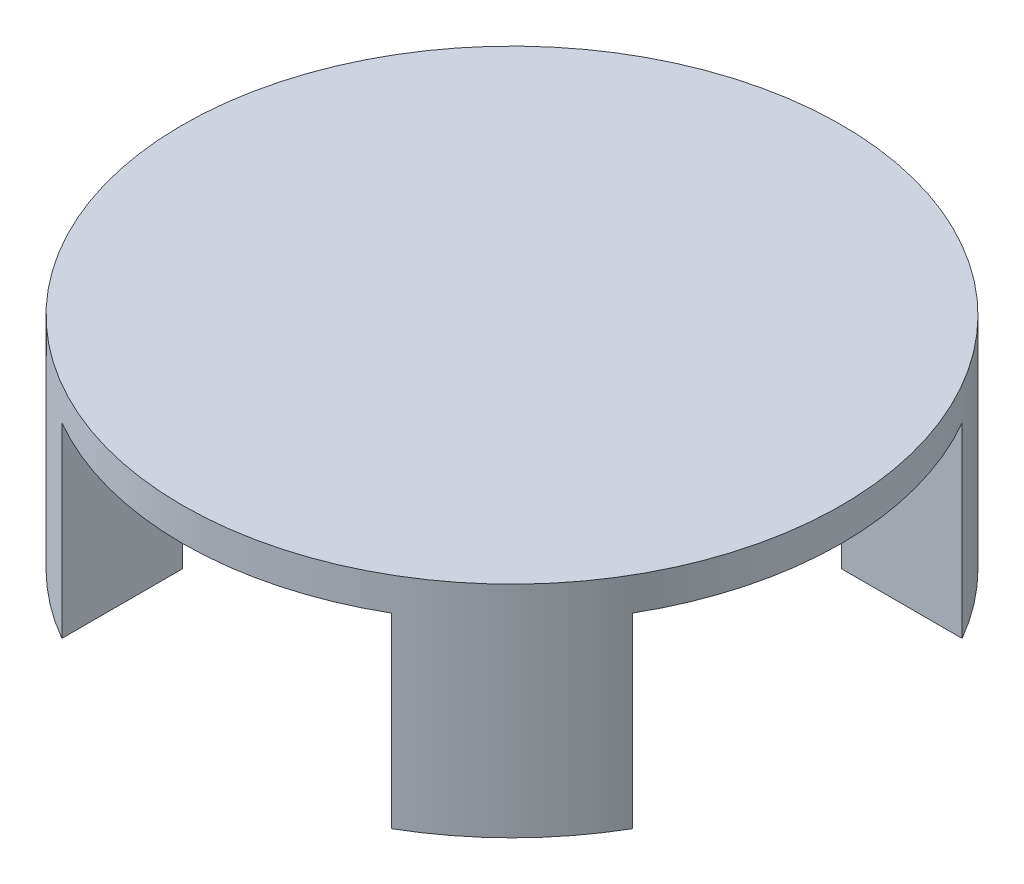
ISO-10303-21;
HEADER;
FILE_DESCRIPTION(('STEP AP214'),'2;1');
FILE_NAME('part.step','',(''),(''),'','','');
FILE_SCHEMA(('AUTOMOTIVE_DESIGN { 1 0 10303 214 1 1 1 1 }'));
ENDSEC;
DATA;
#1=APPLICATION_CONTEXT('core data for automotive mechanical design processes');
#2=APPLICATION_PROTOCOL_DEFINITION('international standard','automotive_design',2000,#1);
#3=PRODUCT_CONTEXT('',#1,'mechanical');
#4=PRODUCT('Part','Part','',(#3));
#5=PRODUCT_RELATED_PRODUCT_CATEGORY('part','',(#4));
#6=PRODUCT_DEFINITION_FORMATION('','',#4);
#7=PRODUCT_DEFINITION_CONTEXT('part definition',#1,'design');
#8=PRODUCT_DEFINITION('design','',#6,#7);
#9=PRODUCT_DEFINITION_SHAPE('','',#8);
#10=(LENGTH_UNIT() NAMED_UNIT(*) SI_UNIT(.MILLI.,.METRE.));
#11=(NAMED_UNIT(*) PLANE_ANGLE_UNIT() SI_UNIT($,.RADIAN.));
#12=(NAMED_UNIT(*) SI_UNIT($,.STERADIAN.) SOLID_ANGLE_UNIT());
#13=UNCERTAINTY_MEASURE_WITH_UNIT(LENGTH_MEASURE(1.E-05),#10,'distance_accuracy_value','');
#14=(GEOMETRIC_REPRESENTATION_CONTEXT(3) GLOBAL_UNCERTAINTY_ASSIGNED_CONTEXT((#13)) GLOBAL_UNIT_ASSIGNED_CONTEXT((#10,
#11,#12)) REPRESENTATION_CONTEXT('',''));
#15=CARTESIAN_POINT('',(0.,0.,0.));
#16=DIRECTION('',(0.,0.,1.));
#17=DIRECTION('',(1.,0.,0.));
#18=AXIS2_PLACEMENT_3D('',#15,#16,#17);
#19=CARTESIAN_POINT('',(0.,0.,0.));
#20=DIRECTION('',(0.,1.,0.));
#21=DIRECTION('',(0.,0.,1.));
#22=AXIS2_PLACEMENT_3D('',#19,#20,#21);
#23=PLANE('',#22);
#24=CARTESIAN_POINT('',(0.,0.,0.));
#25=DIRECTION('',(0.,1.,0.));
#26=DIRECTION('',(0.,0.,1.));
#27=AXIS2_PLACEMENT_3D('',#24,#25,#26);
#28=CIRCLE('',#27,30.);
#29=CARTESIAN_POINT('',(25.9807621135332,0.,-15.));
#30=VERTEX_POINT('',#29);
#31=CARTESIAN_POINT('',(15.,0.,-25.9807621135332));
#32=VERTEX_POINT('',#31);
#33=EDGE_CURVE('E152',#30,#32,#28,.T.);
#34=ORIENTED_EDGE('',*,*,#33,.F.);
#35=DIRECTION('',(1.,0.,0.));
#36=VECTOR('',#35,1.);
#37=CARTESIAN_POINT('',(-30.,0.,-15.));
#38=LINE('',#37,#36);
#39=CARTESIAN_POINT('',(15.,0.,-15.));
#40=VERTEX_POINT('',#39);
#41=EDGE_CURVE('E135',#40,#30,#38,.T.);
#42=ORIENTED_EDGE('',*,*,#41,.F.);
#43=DIRECTION('',(0.,0.,-1.));
#44=VECTOR('',#43,1.);
#45=CARTESIAN_POINT('',(15.,0.,0.));
#46=LINE('',#45,#44);
#47=EDGE_CURVE('E172',#40,#32,#46,.T.);
#48=ORIENTED_EDGE('',*,*,#47,.T.);
#49=EDGE_LOOP('',(#34,#42,#48));
#50=FACE_BOUND('',#49,.T.);
#51=ADVANCED_FACE('F39',(#50),#23,.F.);
#52=DIRECTION('',(0.,0.,1.));
#53=VECTOR('',#52,1.);
#54=CARTESIAN_POINT('',(-15.,0.,0.));
#55=LINE('',#54,#53);
#56=CARTESIAN_POINT('',(-15.,0.,-25.9807621135332));
#57=VERTEX_POINT('',#56);
#58=CARTESIAN_POINT('',(-15.,0.,-15.));
#59=VERTEX_POINT('',#58);
#60=EDGE_CURVE('E176',#57,#59,#55,.T.);
#61=ORIENTED_EDGE('',*,*,#60,.T.);
#62=CARTESIAN_POINT('',(-25.9807621135332,0.,-15.));
#63=VERTEX_POINT('',#62);
#64=EDGE_CURVE('E242',#63,#59,#38,.T.);
#65=ORIENTED_EDGE('',*,*,#64,.F.);
#66=EDGE_CURVE('E148',#57,#63,#28,.T.);
#67=ORIENTED_EDGE('',*,*,#66,.F.);
#68=EDGE_LOOP('',(#61,#65,#67));
#69=FACE_BOUND('',#68,.T.);
#70=ADVANCED_FACE('F248',(#69),#23,.F.);
#71=CARTESIAN_POINT('',(15.,17.,-30.));
#72=DIRECTION('',(1.,0.,0.));
#73=DIRECTION('',(0.,1.,0.));
#74=AXIS2_PLACEMENT_3D('',#71,#72,#73);
#75=PLANE('',#74);
#76=ORIENTED_EDGE('',*,*,#47,.F.);
#77=DIRECTION('',(0.,1.,0.));
#78=VECTOR('',#77,1.);
#79=CARTESIAN_POINT('',(15.,17.,-15.));
#80=LINE('',#79,#78);
#81=CARTESIAN_POINT('',(15.,17.,-15.));
#82=VERTEX_POINT('',#81);
#83=EDGE_CURVE('E142',#40,#82,#80,.T.);
#84=ORIENTED_EDGE('',*,*,#83,.T.);
#85=DIRECTION('',(0.,0.,1.));
#86=VECTOR('',#85,1.);
#87=CARTESIAN_POINT('',(15.,17.,-30.));
#88=LINE('',#87,#86);
#89=CARTESIAN_POINT('',(15.,17.,-25.9807621135332));
#90=VERTEX_POINT('',#89);
#91=EDGE_CURVE('E181',#90,#82,#88,.T.);
#92=ORIENTED_EDGE('',*,*,#91,.F.);
#93=DIRECTION('',(0.,-1.,0.));
#94=VECTOR('',#93,1.);
#95=CARTESIAN_POINT('',(15.,20.,-25.9807621135332));
#96=LINE('',#95,#94);
#97=EDGE_CURVE('E155',#32,#90,#96,.F.);
#98=ORIENTED_EDGE('',*,*,#97,.F.);
#99=EDGE_LOOP('',(#76,#84,#92,#98));
#100=FACE_BOUND('',#99,.T.);
#101=ADVANCED_FACE('F179',(#100),#75,.F.);
#102=CARTESIAN_POINT('',(-15.,17.,-30.));
#103=DIRECTION('',(-1.,0.,0.));
#104=DIRECTION('',(0.,-1.,0.));
#105=AXIS2_PLACEMENT_3D('',#102,#103,#104);
#106=PLANE('',#105);
#107=DIRECTION('',(0.,0.,1.));
#108=VECTOR('',#107,1.);
#109=CARTESIAN_POINT('',(-15.,17.,-30.));
#110=LINE('',#109,#108);
#111=CARTESIAN_POINT('',(-15.,17.,-25.9807621135332));
#112=VERTEX_POINT('',#111);
#113=CARTESIAN_POINT('',(-15.,17.,-15.));
#114=VERTEX_POINT('',#113);
#115=EDGE_CURVE('E206',#112,#114,#110,.T.);
#116=ORIENTED_EDGE('',*,*,#115,.T.);
#117=DIRECTION('',(0.,-1.,0.));
#118=VECTOR('',#117,1.);
#119=CARTESIAN_POINT('',(-15.,17.,-15.));
#120=LINE('',#119,#118);
#121=EDGE_CURVE('E11',#114,#59,#120,.T.);
#122=ORIENTED_EDGE('',*,*,#121,.T.);
#123=ORIENTED_EDGE('',*,*,#60,.F.);
#124=DIRECTION('',(0.,-1.,0.));
#125=VECTOR('',#124,1.);
#126=CARTESIAN_POINT('',(-15.,20.,-25.9807621135332));
#127=LINE('',#126,#125);
#128=EDGE_CURVE('E182',#112,#57,#127,.T.);
#129=ORIENTED_EDGE('',*,*,#128,.F.);
#130=EDGE_LOOP('',(#116,#122,#123,#129));
#131=FACE_BOUND('',#130,.T.);
#132=ADVANCED_FACE('F247',(#131),#106,.F.);
#133=CARTESIAN_POINT('',(15.,0.,25.9807621135332));
#134=VERTEX_POINT('',#133);
#135=CARTESIAN_POINT('',(15.,0.,15.));
#136=VERTEX_POINT('',#135);
#137=EDGE_CURVE('E175',#134,#136,#46,.T.);
#138=ORIENTED_EDGE('',*,*,#137,.T.);
#139=DIRECTION('',(1.,0.,0.));
#140=VECTOR('',#139,1.);
#141=CARTESIAN_POINT('',(-30.,0.,15.));
#142=LINE('',#141,#140);
#143=CARTESIAN_POINT('',(25.9807621135332,0.,15.));
#144=VERTEX_POINT('',#143);
#145=EDGE_CURVE('E54',#136,#144,#142,.T.);
#146=ORIENTED_EDGE('',*,*,#145,.T.);
#147=EDGE_CURVE('E151',#134,#144,#28,.T.);
#148=ORIENTED_EDGE('',*,*,#147,.F.);
#149=EDGE_LOOP('',(#138,#146,#148));
#150=FACE_BOUND('',#149,.T.);
#151=ADVANCED_FACE('F229',(#150),#23,.F.);
#152=CARTESIAN_POINT('',(0.,20.,0.));
#153=DIRECTION('',(0.,-1.,0.));
#154=DIRECTION('',(0.,0.,-1.));
#155=AXIS2_PLACEMENT_3D('',#152,#153,#154);
#156=CYLINDRICAL_SURFACE('',#155,30.);
#157=CARTESIAN_POINT('',(0.,20.,0.));
#158=DIRECTION('',(0.,1.,0.));
#159=DIRECTION('',(0.,0.,1.));
#160=AXIS2_PLACEMENT_3D('',#157,#158,#159);
#161=CIRCLE('',#160,30.);
#162=CARTESIAN_POINT('',(0.,20.,30.));
#163=VERTEX_POINT('',#162);
#164=EDGE_CURVE('E160',#163,#163,#161,.T.);
#165=ORIENTED_EDGE('',*,*,#164,.F.);
#166=EDGE_LOOP('',(#165));
#167=FACE_BOUND('',#166,.T.);
#168=DIRECTION('',(0.,-1.,0.));
#169=VECTOR('',#168,1.);
#170=CARTESIAN_POINT('',(-25.9807621135332,20.,-15.));
#171=LINE('',#170,#169);
#172=CARTESIAN_POINT('',(-25.9807621135332,17.,-15.));
#173=VERTEX_POINT('',#172);
#174=EDGE_CURVE('E237',#63,#173,#171,.F.);
#175=ORIENTED_EDGE('',*,*,#174,.T.);
#176=CARTESIAN_POINT('',(0.,17.,0.));
#177=DIRECTION('',(0.,1.,0.));
#178=DIRECTION('',(0.,0.,1.));
#179=AXIS2_PLACEMENT_3D('',#176,#177,#178);
#180=CIRCLE('',#179,30.);
#181=CARTESIAN_POINT('',(-25.9807621135332,17.,15.));
#182=VERTEX_POINT('',#181);
#183=EDGE_CURVE('E141',#173,#182,#180,.T.);
#184=ORIENTED_EDGE('',*,*,#183,.T.);
#185=DIRECTION('',(0.,-1.,0.));
#186=VECTOR('',#185,1.);
#187=CARTESIAN_POINT('',(-25.9807621135332,20.,15.));
#188=LINE('',#187,#186);
#189=CARTESIAN_POINT('',(-25.9807621135332,0.,15.));
#190=VERTEX_POINT('',#189);
#191=EDGE_CURVE('E130',#182,#190,#188,.T.);
#192=ORIENTED_EDGE('',*,*,#191,.T.);
#193=CARTESIAN_POINT('',(-15.,0.,25.9807621135332));
#194=VERTEX_POINT('',#193);
#195=EDGE_CURVE('E140',#190,#194,#28,.T.);
#196=ORIENTED_EDGE('',*,*,#195,.T.);
#197=DIRECTION('',(0.,-1.,0.));
#198=VECTOR('',#197,1.);
#199=CARTESIAN_POINT('',(-15.,20.,25.9807621135332));
#200=LINE('',#199,#198);
#201=CARTESIAN_POINT('',(-15.,17.,25.9807621135332));
#202=VERTEX_POINT('',#201);
#203=EDGE_CURVE('E185',#194,#202,#200,.F.);
#204=ORIENTED_EDGE('',*,*,#203,.T.);
#205=CARTESIAN_POINT('',(0.,17.,0.));
#206=DIRECTION('',(0.,1.,0.));
#207=DIRECTION('',(0.,0.,1.));
#208=AXIS2_PLACEMENT_3D('',#205,#206,#207);
#209=CIRCLE('',#208,30.);
#210=CARTESIAN_POINT('',(15.,17.,25.9807621135332));
#211=VERTEX_POINT('',#210);
#212=EDGE_CURVE('E194',#202,#211,#209,.T.);
#213=ORIENTED_EDGE('',*,*,#212,.T.);
#214=DIRECTION('',(0.,-1.,0.));
#215=VECTOR('',#214,1.);
#216=CARTESIAN_POINT('',(15.,20.,25.9807621135332));
#217=LINE('',#216,#215);
#218=EDGE_CURVE('E149',#211,#134,#217,.T.);
#219=ORIENTED_EDGE('',*,*,#218,.T.);
#220=ORIENTED_EDGE('',*,*,#147,.T.);
#221=DIRECTION('',(0.,-1.,0.));
#222=VECTOR('',#221,1.);
#223=CARTESIAN_POINT('',(25.9807621135332,20.,15.));
#224=LINE('',#223,#222);
#225=CARTESIAN_POINT('',(25.9807621135332,17.,15.));
#226=VERTEX_POINT('',#225);
#227=EDGE_CURVE('E143',#144,#226,#224,.F.);
#228=ORIENTED_EDGE('',*,*,#227,.T.);
#229=CARTESIAN_POINT('',(25.9807621135332,17.,-15.));
#230=VERTEX_POINT('',#229);
#231=EDGE_CURVE('E214',#226,#230,#180,.T.);
#232=ORIENTED_EDGE('',*,*,#231,.T.);
#233=DIRECTION('',(0.,-1.,0.));
#234=VECTOR('',#233,1.);
#235=CARTESIAN_POINT('',(25.9807621135332,20.,-15.));
#236=LINE('',#235,#234);
#237=EDGE_CURVE('E168',#230,#30,#236,.T.);
#238=ORIENTED_EDGE('',*,*,#237,.T.);
#239=ORIENTED_EDGE('',*,*,#33,.T.);
#240=ORIENTED_EDGE('',*,*,#97,.T.);
#241=EDGE_CURVE('E196',#90,#112,#209,.T.);
#242=ORIENTED_EDGE('',*,*,#241,.T.);
#243=ORIENTED_EDGE('',*,*,#128,.T.);
#244=ORIENTED_EDGE('',*,*,#66,.T.);
#245=EDGE_LOOP('',(#175,#184,#192,#196,#204,#213,#219,#220,#228,#232,#238,#239,#240,#242,#243,#244));
#246=FACE_BOUND('',#245,.T.);
#247=ADVANCED_FACE('F41',(#167,#246),#156,.T.);
#248=CARTESIAN_POINT('',(0.,20.,0.));
#249=DIRECTION('',(0.,1.,0.));
#250=DIRECTION('',(0.,0.,1.));
#251=AXIS2_PLACEMENT_3D('',#248,#249,#250);
#252=PLANE('',#251);
#253=ORIENTED_EDGE('',*,*,#164,.T.);
#254=EDGE_LOOP('',(#253));
#255=FACE_BOUND('',#254,.T.);
#256=ADVANCED_FACE('F261',(#255),#252,.T.);
#257=ORIENTED_EDGE('',*,*,#195,.F.);
#258=CARTESIAN_POINT('',(-15.,0.,15.));
#259=VERTEX_POINT('',#258);
#260=EDGE_CURVE('E127',#190,#259,#142,.T.);
#261=ORIENTED_EDGE('',*,*,#260,.T.);
#262=EDGE_CURVE('E146',#259,#194,#55,.T.);
#263=ORIENTED_EDGE('',*,*,#262,.T.);
#264=EDGE_LOOP('',(#257,#261,#263));
#265=FACE_BOUND('',#264,.T.);
#266=ADVANCED_FACE('F145',(#265),#23,.F.);
#267=CARTESIAN_POINT('',(-15.,17.,-30.));
#268=DIRECTION('',(0.,1.,0.));
#269=DIRECTION('',(0.,0.,1.));
#270=AXIS2_PLACEMENT_3D('',#267,#268,#269);
#271=PLANE('',#270);
#272=CARTESIAN_POINT('',(-15.,17.,15.));
#273=VERTEX_POINT('',#272);
#274=EDGE_CURVE('E211',#273,#202,#110,.T.);
#275=ORIENTED_EDGE('',*,*,#274,.F.);
#276=DIRECTION('',(1.,0.,0.));
#277=VECTOR('',#276,1.);
#278=CARTESIAN_POINT('',(-30.,17.,15.));
#279=LINE('',#278,#277);
#280=EDGE_CURVE('E62',#182,#273,#279,.T.);
#281=ORIENTED_EDGE('',*,*,#280,.F.);
#282=ORIENTED_EDGE('',*,*,#183,.F.);
#283=DIRECTION('',(1.,0.,0.));
#284=VECTOR('',#283,1.);
#285=CARTESIAN_POINT('',(-30.,17.,-15.));
#286=LINE('',#285,#284);
#287=EDGE_CURVE('E208',#173,#114,#286,.T.);
#288=ORIENTED_EDGE('',*,*,#287,.T.);
#289=ORIENTED_EDGE('',*,*,#115,.F.);
#290=ORIENTED_EDGE('',*,*,#241,.F.);
#291=ORIENTED_EDGE('',*,*,#91,.T.);
#292=EDGE_CURVE('E241',#82,#230,#286,.T.);
#293=ORIENTED_EDGE('',*,*,#292,.T.);
#294=ORIENTED_EDGE('',*,*,#231,.F.);
#295=CARTESIAN_POINT('',(15.,17.,15.));
#296=VERTEX_POINT('',#295);
#297=EDGE_CURVE('E222',#296,#226,#279,.T.);
#298=ORIENTED_EDGE('',*,*,#297,.F.);
#299=EDGE_CURVE('E210',#296,#211,#88,.T.);
#300=ORIENTED_EDGE('',*,*,#299,.T.);
#301=ORIENTED_EDGE('',*,*,#212,.F.);
#302=EDGE_LOOP('',(#275,#281,#282,#288,#289,#290,#291,#293,#294,#298,#300,#301));
#303=FACE_BOUND('',#302,.T.);
#304=ADVANCED_FACE('F202',(#303),#271,.F.);
#305=ORIENTED_EDGE('',*,*,#299,.F.);
#306=DIRECTION('',(0.,-1.,0.));
#307=VECTOR('',#306,1.);
#308=CARTESIAN_POINT('',(15.,17.,15.));
#309=LINE('',#308,#307);
#310=EDGE_CURVE('E225',#296,#136,#309,.T.);
#311=ORIENTED_EDGE('',*,*,#310,.T.);
#312=ORIENTED_EDGE('',*,*,#137,.F.);
#313=ORIENTED_EDGE('',*,*,#218,.F.);
#314=EDGE_LOOP('',(#305,#311,#312,#313));
#315=FACE_BOUND('',#314,.T.);
#316=ADVANCED_FACE('F224',(#315),#75,.F.);
#317=ORIENTED_EDGE('',*,*,#262,.F.);
#318=DIRECTION('',(0.,1.,0.));
#319=VECTOR('',#318,1.);
#320=CARTESIAN_POINT('',(-15.,17.,15.));
#321=LINE('',#320,#319);
#322=EDGE_CURVE('E47',#259,#273,#321,.T.);
#323=ORIENTED_EDGE('',*,*,#322,.T.);
#324=ORIENTED_EDGE('',*,*,#274,.T.);
#325=ORIENTED_EDGE('',*,*,#203,.F.);
#326=EDGE_LOOP('',(#317,#323,#324,#325));
#327=FACE_BOUND('',#326,.T.);
#328=ADVANCED_FACE('F218',(#327),#106,.F.);
#329=CARTESIAN_POINT('',(-30.,17.,15.));
#330=DIRECTION('',(0.,0.,1.));
#331=DIRECTION('',(0.,-1.,0.));
#332=AXIS2_PLACEMENT_3D('',#329,#330,#331);
#333=PLANE('',#332);
#334=ORIENTED_EDGE('',*,*,#280,.T.);
#335=ORIENTED_EDGE('',*,*,#322,.F.);
#336=ORIENTED_EDGE('',*,*,#260,.F.);
#337=ORIENTED_EDGE('',*,*,#191,.F.);
#338=EDGE_LOOP('',(#334,#335,#336,#337));
#339=FACE_BOUND('',#338,.T.);
#340=ADVANCED_FACE('F129',(#339),#333,.F.);
#341=CARTESIAN_POINT('',(-30.,17.,-15.));
#342=DIRECTION('',(0.,0.,-1.));
#343=DIRECTION('',(0.,1.,0.));
#344=AXIS2_PLACEMENT_3D('',#341,#342,#343);
#345=PLANE('',#344);
#346=ORIENTED_EDGE('',*,*,#64,.T.);
#347=ORIENTED_EDGE('',*,*,#121,.F.);
#348=ORIENTED_EDGE('',*,*,#287,.F.);
#349=ORIENTED_EDGE('',*,*,#174,.F.);
#350=EDGE_LOOP('',(#346,#347,#348,#349));
#351=FACE_BOUND('',#350,.T.);
#352=ADVANCED_FACE('F245',(#351),#345,.F.);
#353=ORIENTED_EDGE('',*,*,#292,.F.);
#354=ORIENTED_EDGE('',*,*,#83,.F.);
#355=ORIENTED_EDGE('',*,*,#41,.T.);
#356=ORIENTED_EDGE('',*,*,#237,.F.);
#357=EDGE_LOOP('',(#353,#354,#355,#356));
#358=FACE_BOUND('',#357,.T.);
#359=ADVANCED_FACE('F240',(#358),#345,.F.);
#360=ORIENTED_EDGE('',*,*,#145,.F.);
#361=ORIENTED_EDGE('',*,*,#310,.F.);
#362=ORIENTED_EDGE('',*,*,#297,.T.);
#363=ORIENTED_EDGE('',*,*,#227,.F.);
#364=EDGE_LOOP('',(#360,#361,#362,#363));
#365=FACE_BOUND('',#364,.T.);
#366=ADVANCED_FACE('F277',(#365),#333,.F.);
#367=CLOSED_SHELL('',(#51,#70,#101,#132,#151,#247,#256,#266,#304,#316,#328,#340,#352,#359,#366));
#368=MANIFOLD_SOLID_BREP('B2',#367);
#369=ADVANCED_BREP_SHAPE_REPRESENTATION('',(#18,#368),#14);
#370=SHAPE_DEFINITION_REPRESENTATION(#9,#369);
ENDSEC;
END-ISO-10303-21;
